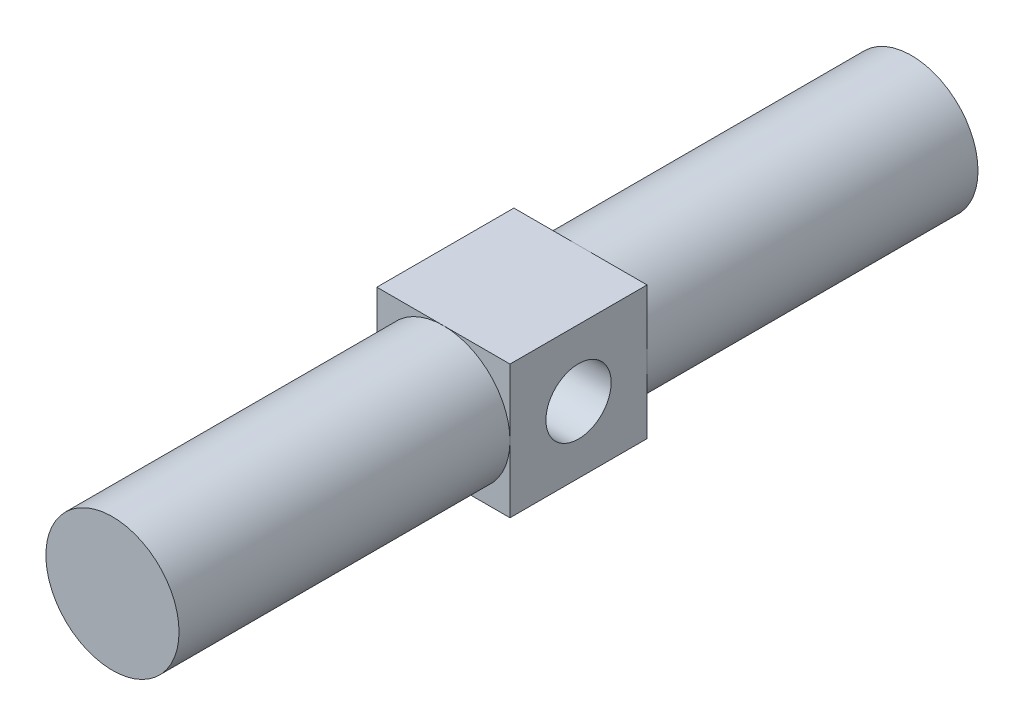
ISO-10303-21;
HEADER;
FILE_DESCRIPTION(('STEP AP214'),'2;1');
FILE_NAME('part.step','',(''),(''),'','','');
FILE_SCHEMA(('AUTOMOTIVE_DESIGN { 1 0 10303 214 1 1 1 1 }'));
ENDSEC;
DATA;
#1=APPLICATION_CONTEXT('core data for automotive mechanical design processes');
#2=APPLICATION_PROTOCOL_DEFINITION('international standard','automotive_design',2000,#1);
#3=PRODUCT_CONTEXT('',#1,'mechanical');
#4=PRODUCT('Part','Part','',(#3));
#5=PRODUCT_RELATED_PRODUCT_CATEGORY('part','',(#4));
#6=PRODUCT_DEFINITION_FORMATION('','',#4);
#7=PRODUCT_DEFINITION_CONTEXT('part definition',#1,'design');
#8=PRODUCT_DEFINITION('design','',#6,#7);
#9=PRODUCT_DEFINITION_SHAPE('','',#8);
#10=(LENGTH_UNIT() NAMED_UNIT(*) SI_UNIT(.MILLI.,.METRE.));
#11=(NAMED_UNIT(*) PLANE_ANGLE_UNIT() SI_UNIT($,.RADIAN.));
#12=(NAMED_UNIT(*) SI_UNIT($,.STERADIAN.) SOLID_ANGLE_UNIT());
#13=UNCERTAINTY_MEASURE_WITH_UNIT(LENGTH_MEASURE(1.E-05),#10,'distance_accuracy_value','');
#14=(GEOMETRIC_REPRESENTATION_CONTEXT(3) GLOBAL_UNCERTAINTY_ASSIGNED_CONTEXT((#13)) GLOBAL_UNIT_ASSIGNED_CONTEXT((#10,
#11,#12)) REPRESENTATION_CONTEXT('',''));
#15=CARTESIAN_POINT('',(0.,0.,0.));
#16=DIRECTION('',(0.,0.,1.));
#17=DIRECTION('',(1.,0.,0.));
#18=AXIS2_PLACEMENT_3D('',#15,#16,#17);
#19=CARTESIAN_POINT('',(0.,0.,76.2));
#20=DIRECTION('',(0.,0.,-1.));
#21=DIRECTION('',(-1.,0.,0.));
#22=AXIS2_PLACEMENT_3D('',#19,#20,#21);
#23=CYLINDRICAL_SURFACE('',#22,6.35);
#24=CARTESIAN_POINT('',(0.,0.,44.635649581861));
#25=DIRECTION('',(0.,0.,1.));
#26=DIRECTION('',(1.,0.,0.));
#27=AXIS2_PLACEMENT_3D('',#24,#25,#26);
#28=CIRCLE('',#27,6.35);
#29=CARTESIAN_POINT('',(0.,-6.35,44.635649581861));
#30=VERTEX_POINT('',#29);
#31=CARTESIAN_POINT('',(6.35,0.,44.635649581861));
#32=VERTEX_POINT('',#31);
#33=EDGE_CURVE('E36',#30,#32,#28,.T.);
#34=ORIENTED_EDGE('',*,*,#33,.T.);
#35=CARTESIAN_POINT('',(0.,6.35,44.635649581861));
#36=VERTEX_POINT('',#35);
#37=EDGE_CURVE('E164',#32,#36,#28,.T.);
#38=ORIENTED_EDGE('',*,*,#37,.T.);
#39=CARTESIAN_POINT('',(-6.35,0.,44.635649581861));
#40=VERTEX_POINT('',#39);
#41=EDGE_CURVE('E166',#36,#40,#28,.T.);
#42=ORIENTED_EDGE('',*,*,#41,.T.);
#43=EDGE_CURVE('E163',#40,#30,#28,.T.);
#44=ORIENTED_EDGE('',*,*,#43,.T.);
#45=EDGE_LOOP('',(#34,#38,#42,#44));
#46=FACE_BOUND('',#45,.T.);
#47=CARTESIAN_POINT('',(0.,0.,76.2));
#48=DIRECTION('',(0.,0.,1.));
#49=DIRECTION('',(1.,0.,0.));
#50=AXIS2_PLACEMENT_3D('',#47,#48,#49);
#51=CIRCLE('',#50,6.35);
#52=CARTESIAN_POINT('',(6.35,0.,76.2));
#53=VERTEX_POINT('',#52);
#54=EDGE_CURVE('E154',#53,#53,#51,.T.);
#55=ORIENTED_EDGE('',*,*,#54,.F.);
#56=EDGE_LOOP('',(#55));
#57=FACE_BOUND('',#56,.T.);
#58=ADVANCED_FACE('F33',(#46,#57),#23,.T.);
#59=CARTESIAN_POINT('',(0.,0.,76.2));
#60=DIRECTION('',(0.,0.,1.));
#61=DIRECTION('',(1.,0.,0.));
#62=AXIS2_PLACEMENT_3D('',#59,#60,#61);
#63=PLANE('',#62);
#64=ORIENTED_EDGE('',*,*,#54,.T.);
#65=EDGE_LOOP('',(#64));
#66=FACE_BOUND('',#65,.T.);
#67=ADVANCED_FACE('F197',(#66),#63,.T.);
#68=CARTESIAN_POINT('',(-6.35,6.35,44.635649581861));
#69=DIRECTION('',(0.,0.,1.));
#70=DIRECTION('',(1.,0.,0.));
#71=AXIS2_PLACEMENT_3D('',#68,#69,#70);
#72=PLANE('',#71);
#73=ORIENTED_EDGE('',*,*,#37,.F.);
#74=DIRECTION('',(0.,-1.,0.));
#75=VECTOR('',#74,1.);
#76=CARTESIAN_POINT('',(6.35,6.35,44.635649581861));
#77=LINE('',#76,#75);
#78=CARTESIAN_POINT('',(6.35,6.35,44.635649581861));
#79=VERTEX_POINT('',#78);
#80=EDGE_CURVE('E57',#79,#32,#77,.T.);
#81=ORIENTED_EDGE('',*,*,#80,.F.);
#82=DIRECTION('',(1.,0.,0.));
#83=VECTOR('',#82,1.);
#84=CARTESIAN_POINT('',(-6.35,6.35,44.635649581861));
#85=LINE('',#84,#83);
#86=EDGE_CURVE('E147',#36,#79,#85,.T.);
#87=ORIENTED_EDGE('',*,*,#86,.F.);
#88=EDGE_LOOP('',(#73,#81,#87));
#89=FACE_BOUND('',#88,.T.);
#90=ADVANCED_FACE('F195',(#89),#72,.T.);
#91=ORIENTED_EDGE('',*,*,#41,.F.);
#92=CARTESIAN_POINT('',(-6.35,6.35,44.635649581861));
#93=VERTEX_POINT('',#92);
#94=EDGE_CURVE('E143',#93,#36,#85,.T.);
#95=ORIENTED_EDGE('',*,*,#94,.F.);
#96=DIRECTION('',(0.,-1.,0.));
#97=VECTOR('',#96,1.);
#98=CARTESIAN_POINT('',(-6.35,6.35,44.635649581861));
#99=LINE('',#98,#97);
#100=EDGE_CURVE('E133',#93,#40,#99,.T.);
#101=ORIENTED_EDGE('',*,*,#100,.T.);
#102=EDGE_LOOP('',(#91,#95,#101));
#103=FACE_BOUND('',#102,.T.);
#104=ADVANCED_FACE('F180',(#103),#72,.T.);
#105=ORIENTED_EDGE('',*,*,#43,.F.);
#106=CARTESIAN_POINT('',(-6.35,-6.35,44.635649581861));
#107=VERTEX_POINT('',#106);
#108=EDGE_CURVE('E132',#40,#107,#99,.T.);
#109=ORIENTED_EDGE('',*,*,#108,.T.);
#110=DIRECTION('',(1.,0.,0.));
#111=VECTOR('',#110,1.);
#112=CARTESIAN_POINT('',(-6.35,-6.35,44.635649581861));
#113=LINE('',#112,#111);
#114=EDGE_CURVE('E109',#107,#30,#113,.T.);
#115=ORIENTED_EDGE('',*,*,#114,.T.);
#116=EDGE_LOOP('',(#105,#109,#115));
#117=FACE_BOUND('',#116,.T.);
#118=ADVANCED_FACE('F173',(#117),#72,.T.);
#119=CARTESIAN_POINT('',(-6.35,6.35,44.635649581861));
#120=DIRECTION('',(0.,1.,0.));
#121=DIRECTION('',(0.,0.,1.));
#122=AXIS2_PLACEMENT_3D('',#119,#120,#121);
#123=PLANE('',#122);
#124=DIRECTION('',(1.,0.,0.));
#125=VECTOR('',#124,1.);
#126=CARTESIAN_POINT('',(-6.35,6.35,31.5643504972274));
#127=LINE('',#126,#125);
#128=CARTESIAN_POINT('',(0.,6.35,31.5643504972274));
#129=VERTEX_POINT('',#128);
#130=CARTESIAN_POINT('',(6.35,6.35,31.5643504972274));
#131=VERTEX_POINT('',#130);
#132=EDGE_CURVE('E151',#129,#131,#127,.T.);
#133=ORIENTED_EDGE('',*,*,#132,.F.);
#134=CARTESIAN_POINT('',(-6.35,6.35,31.5643504972274));
#135=VERTEX_POINT('',#134);
#136=EDGE_CURVE('E148',#135,#129,#127,.T.);
#137=ORIENTED_EDGE('',*,*,#136,.F.);
#138=DIRECTION('',(0.,0.,1.));
#139=VECTOR('',#138,1.);
#140=CARTESIAN_POINT('',(-6.35,6.35,44.635649581861));
#141=LINE('',#140,#139);
#142=EDGE_CURVE('E110',#135,#93,#141,.T.);
#143=ORIENTED_EDGE('',*,*,#142,.T.);
#144=ORIENTED_EDGE('',*,*,#94,.T.);
#145=ORIENTED_EDGE('',*,*,#86,.T.);
#146=DIRECTION('',(0.,0.,1.));
#147=VECTOR('',#146,1.);
#148=CARTESIAN_POINT('',(6.35,6.35,44.635649581861));
#149=LINE('',#148,#147);
#150=EDGE_CURVE('E130',#131,#79,#149,.T.);
#151=ORIENTED_EDGE('',*,*,#150,.F.);
#152=EDGE_LOOP('',(#133,#137,#143,#144,#145,#151));
#153=FACE_BOUND('',#152,.T.);
#154=ADVANCED_FACE('F184',(#153),#123,.T.);
#155=CARTESIAN_POINT('',(-6.35,6.35,31.5643504972274));
#156=DIRECTION('',(0.,0.,-1.));
#157=DIRECTION('',(-1.,0.,0.));
#158=AXIS2_PLACEMENT_3D('',#155,#156,#157);
#159=PLANE('',#158);
#160=CARTESIAN_POINT('',(0.,0.,31.5643504972274));
#161=DIRECTION('',(0.,0.,-1.));
#162=DIRECTION('',(-1.,0.,0.));
#163=AXIS2_PLACEMENT_3D('',#160,#161,#162);
#164=CIRCLE('',#163,6.35);
#165=CARTESIAN_POINT('',(-6.35,0.,31.5643504972274));
#166=VERTEX_POINT('',#165);
#167=EDGE_CURVE('E11',#166,#129,#164,.T.);
#168=ORIENTED_EDGE('',*,*,#167,.F.);
#169=DIRECTION('',(0.,1.,0.));
#170=VECTOR('',#169,1.);
#171=CARTESIAN_POINT('',(-6.35,6.35,31.5643504972274));
#172=LINE('',#171,#170);
#173=EDGE_CURVE('E139',#166,#135,#172,.T.);
#174=ORIENTED_EDGE('',*,*,#173,.T.);
#175=ORIENTED_EDGE('',*,*,#136,.T.);
#176=EDGE_LOOP('',(#168,#174,#175));
#177=FACE_BOUND('',#176,.T.);
#178=ADVANCED_FACE('F189',(#177),#159,.T.);
#179=CARTESIAN_POINT('',(6.35,0.,31.5643504972274));
#180=VERTEX_POINT('',#179);
#181=EDGE_CURVE('E41',#129,#180,#164,.T.);
#182=ORIENTED_EDGE('',*,*,#181,.F.);
#183=ORIENTED_EDGE('',*,*,#132,.T.);
#184=DIRECTION('',(0.,1.,0.));
#185=VECTOR('',#184,1.);
#186=CARTESIAN_POINT('',(6.35,6.35,31.5643504972274));
#187=LINE('',#186,#185);
#188=EDGE_CURVE('E123',#180,#131,#187,.T.);
#189=ORIENTED_EDGE('',*,*,#188,.F.);
#190=EDGE_LOOP('',(#182,#183,#189));
#191=FACE_BOUND('',#190,.T.);
#192=ADVANCED_FACE('F193',(#191),#159,.T.);
#193=CARTESIAN_POINT('',(0.,-6.35,31.5643504972274));
#194=VERTEX_POINT('',#193);
#195=EDGE_CURVE('E42',#180,#194,#164,.T.);
#196=ORIENTED_EDGE('',*,*,#195,.F.);
#197=CARTESIAN_POINT('',(6.35,-6.35,31.5643504972274));
#198=VERTEX_POINT('',#197);
#199=EDGE_CURVE('E126',#198,#180,#187,.T.);
#200=ORIENTED_EDGE('',*,*,#199,.F.);
#201=DIRECTION('',(1.,0.,0.));
#202=VECTOR('',#201,1.);
#203=CARTESIAN_POINT('',(-6.35,-6.35,31.5643504972274));
#204=LINE('',#203,#202);
#205=EDGE_CURVE('E122',#194,#198,#204,.T.);
#206=ORIENTED_EDGE('',*,*,#205,.F.);
#207=EDGE_LOOP('',(#196,#200,#206));
#208=FACE_BOUND('',#207,.T.);
#209=ADVANCED_FACE('F227',(#208),#159,.T.);
#210=CARTESIAN_POINT('',(-6.35,-6.35,44.635649581861));
#211=DIRECTION('',(0.,-1.,0.));
#212=DIRECTION('',(0.,0.,-1.));
#213=AXIS2_PLACEMENT_3D('',#210,#211,#212);
#214=PLANE('',#213);
#215=CARTESIAN_POINT('',(-6.35,-6.35,31.5643504972274));
#216=VERTEX_POINT('',#215);
#217=EDGE_CURVE('E152',#216,#194,#204,.T.);
#218=ORIENTED_EDGE('',*,*,#217,.T.);
#219=ORIENTED_EDGE('',*,*,#205,.T.);
#220=DIRECTION('',(0.,0.,-1.));
#221=VECTOR('',#220,1.);
#222=CARTESIAN_POINT('',(6.35,-6.35,44.635649581861));
#223=LINE('',#222,#221);
#224=CARTESIAN_POINT('',(6.35,-6.35,44.635649581861));
#225=VERTEX_POINT('',#224);
#226=EDGE_CURVE('E115',#225,#198,#223,.T.);
#227=ORIENTED_EDGE('',*,*,#226,.F.);
#228=EDGE_CURVE('E100',#30,#225,#113,.T.);
#229=ORIENTED_EDGE('',*,*,#228,.F.);
#230=ORIENTED_EDGE('',*,*,#114,.F.);
#231=DIRECTION('',(0.,0.,-1.));
#232=VECTOR('',#231,1.);
#233=CARTESIAN_POINT('',(-6.35,-6.35,44.635649581861));
#234=LINE('',#233,#232);
#235=EDGE_CURVE('E136',#107,#216,#234,.T.);
#236=ORIENTED_EDGE('',*,*,#235,.T.);
#237=EDGE_LOOP('',(#218,#219,#227,#229,#230,#236));
#238=FACE_BOUND('',#237,.T.);
#239=ADVANCED_FACE('F120',(#238),#214,.T.);
#240=CARTESIAN_POINT('',(-6.35,0.,0.));
#241=DIRECTION('',(1.,0.,0.));
#242=DIRECTION('',(0.,0.,-1.));
#243=AXIS2_PLACEMENT_3D('',#240,#241,#242);
#244=PLANE('',#243);
#245=CARTESIAN_POINT('',(-6.35,0.,38.1));
#246=DIRECTION('',(1.,0.,0.));
#247=DIRECTION('',(0.,0.,-1.));
#248=AXIS2_PLACEMENT_3D('',#245,#246,#247);
#249=CIRCLE('',#248,3.1115);
#250=CARTESIAN_POINT('',(-6.35,0.,34.9885));
#251=VERTEX_POINT('',#250);
#252=EDGE_CURVE('E338',#251,#251,#249,.T.);
#253=ORIENTED_EDGE('',*,*,#252,.T.);
#254=EDGE_LOOP('',(#253));
#255=FACE_BOUND('',#254,.T.);
#256=ORIENTED_EDGE('',*,*,#108,.F.);
#257=ORIENTED_EDGE('',*,*,#100,.F.);
#258=ORIENTED_EDGE('',*,*,#142,.F.);
#259=ORIENTED_EDGE('',*,*,#173,.F.);
#260=EDGE_CURVE('E49',#216,#166,#172,.T.);
#261=ORIENTED_EDGE('',*,*,#260,.F.);
#262=ORIENTED_EDGE('',*,*,#235,.F.);
#263=EDGE_LOOP('',(#256,#257,#258,#259,#261,#262));
#264=FACE_BOUND('',#263,.T.);
#265=ADVANCED_FACE('F177',(#255,#264),#244,.F.);
#266=CARTESIAN_POINT('',(6.35,0.,0.));
#267=DIRECTION('',(1.,0.,0.));
#268=DIRECTION('',(0.,0.,-1.));
#269=AXIS2_PLACEMENT_3D('',#266,#267,#268);
#270=PLANE('',#269);
#271=CARTESIAN_POINT('',(6.35,0.,38.1));
#272=DIRECTION('',(1.,0.,0.));
#273=DIRECTION('',(0.,0.,-1.));
#274=AXIS2_PLACEMENT_3D('',#271,#272,#273);
#275=CIRCLE('',#274,3.1115);
#276=CARTESIAN_POINT('',(6.35,0.,34.9885));
#277=VERTEX_POINT('',#276);
#278=EDGE_CURVE('E117',#277,#277,#275,.T.);
#279=ORIENTED_EDGE('',*,*,#278,.F.);
#280=EDGE_LOOP('',(#279));
#281=FACE_BOUND('',#280,.T.);
#282=ORIENTED_EDGE('',*,*,#199,.T.);
#283=ORIENTED_EDGE('',*,*,#188,.T.);
#284=ORIENTED_EDGE('',*,*,#150,.T.);
#285=ORIENTED_EDGE('',*,*,#80,.T.);
#286=EDGE_CURVE('E102',#32,#225,#77,.T.);
#287=ORIENTED_EDGE('',*,*,#286,.T.);
#288=ORIENTED_EDGE('',*,*,#226,.T.);
#289=EDGE_LOOP('',(#282,#283,#284,#285,#287,#288));
#290=FACE_BOUND('',#289,.T.);
#291=ADVANCED_FACE('F114',(#281,#290),#270,.T.);
#292=ORIENTED_EDGE('',*,*,#33,.F.);
#293=ORIENTED_EDGE('',*,*,#228,.T.);
#294=ORIENTED_EDGE('',*,*,#286,.F.);
#295=EDGE_LOOP('',(#292,#293,#294));
#296=FACE_BOUND('',#295,.T.);
#297=ADVANCED_FACE('F101',(#296),#72,.T.);
#298=EDGE_CURVE('E159',#194,#166,#164,.T.);
#299=ORIENTED_EDGE('',*,*,#298,.F.);
#300=ORIENTED_EDGE('',*,*,#217,.F.);
#301=ORIENTED_EDGE('',*,*,#260,.T.);
#302=EDGE_LOOP('',(#299,#300,#301));
#303=FACE_BOUND('',#302,.T.);
#304=ADVANCED_FACE('F207',(#303),#159,.T.);
#305=CARTESIAN_POINT('',(0.,0.,0.));
#306=DIRECTION('',(0.,0.,1.));
#307=DIRECTION('',(1.,0.,0.));
#308=AXIS2_PLACEMENT_3D('',#305,#306,#307);
#309=PLANE('',#308);
#310=CARTESIAN_POINT('',(0.,0.,0.));
#311=DIRECTION('',(0.,0.,1.));
#312=DIRECTION('',(1.,0.,0.));
#313=AXIS2_PLACEMENT_3D('',#310,#311,#312);
#314=CIRCLE('',#313,6.35);
#315=CARTESIAN_POINT('',(6.35,0.,0.));
#316=VERTEX_POINT('',#315);
#317=EDGE_CURVE('E146',#316,#316,#314,.T.);
#318=ORIENTED_EDGE('',*,*,#317,.F.);
#319=EDGE_LOOP('',(#318));
#320=FACE_BOUND('',#319,.T.);
#321=ADVANCED_FACE('F213',(#320),#309,.F.);
#322=ORIENTED_EDGE('',*,*,#317,.T.);
#323=EDGE_LOOP('',(#322));
#324=FACE_BOUND('',#323,.T.);
#325=ORIENTED_EDGE('',*,*,#298,.T.);
#326=ORIENTED_EDGE('',*,*,#167,.T.);
#327=ORIENTED_EDGE('',*,*,#181,.T.);
#328=ORIENTED_EDGE('',*,*,#195,.T.);
#329=EDGE_LOOP('',(#325,#326,#327,#328));
#330=FACE_BOUND('',#329,.T.);
#331=ADVANCED_FACE('F190',(#324,#330),#23,.T.);
#332=CARTESIAN_POINT('',(6.35,0.,38.1));
#333=DIRECTION('',(-1.,0.,0.));
#334=DIRECTION('',(0.,0.,1.));
#335=AXIS2_PLACEMENT_3D('',#332,#333,#334);
#336=CYLINDRICAL_SURFACE('',#335,3.1115);
#337=ORIENTED_EDGE('',*,*,#278,.T.);
#338=EDGE_LOOP('',(#337));
#339=FACE_BOUND('',#338,.T.);
#340=ORIENTED_EDGE('',*,*,#252,.F.);
#341=EDGE_LOOP('',(#340));
#342=FACE_BOUND('',#341,.T.);
#343=ADVANCED_FACE('F212',(#339,#342),#336,.F.);
#344=CLOSED_SHELL('',(#58,#67,#90,#104,#118,#154,#178,#192,#209,#239,#265,#291,#297,#304,#321,
#331,#343));
#345=MANIFOLD_SOLID_BREP('B2',#344);
#346=ADVANCED_BREP_SHAPE_REPRESENTATION('',(#18,#345),#14);
#347=SHAPE_DEFINITION_REPRESENTATION(#9,#346);
ENDSEC;
END-ISO-10303-21;
